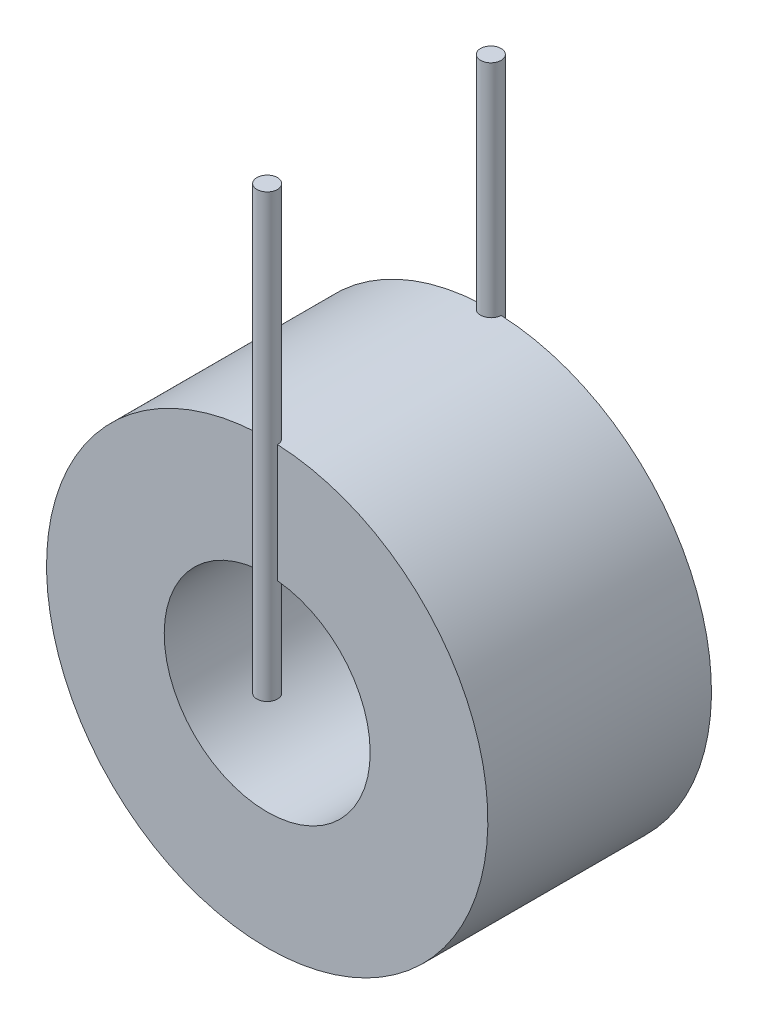
ISO-10303-21;
HEADER;
FILE_DESCRIPTION(('STEP AP214'),'2;1');
FILE_NAME('part.step','',(''),(''),'','','');
FILE_SCHEMA(('AUTOMOTIVE_DESIGN { 1 0 10303 214 1 1 1 1 }'));
ENDSEC;
DATA;
#1=APPLICATION_CONTEXT('core data for automotive mechanical design processes');
#2=APPLICATION_PROTOCOL_DEFINITION('international standard','automotive_design',2000,#1);
#3=PRODUCT_CONTEXT('',#1,'mechanical');
#4=PRODUCT('Part','Part','',(#3));
#5=PRODUCT_RELATED_PRODUCT_CATEGORY('part','',(#4));
#6=PRODUCT_DEFINITION_FORMATION('','',#4);
#7=PRODUCT_DEFINITION_CONTEXT('part definition',#1,'design');
#8=PRODUCT_DEFINITION('design','',#6,#7);
#9=PRODUCT_DEFINITION_SHAPE('','',#8);
#10=(LENGTH_UNIT() NAMED_UNIT(*) SI_UNIT(.MILLI.,.METRE.));
#11=(NAMED_UNIT(*) PLANE_ANGLE_UNIT() SI_UNIT($,.RADIAN.));
#12=(NAMED_UNIT(*) SI_UNIT($,.STERADIAN.) SOLID_ANGLE_UNIT());
#13=UNCERTAINTY_MEASURE_WITH_UNIT(LENGTH_MEASURE(1.E-05),#10,'distance_accuracy_value','');
#14=(GEOMETRIC_REPRESENTATION_CONTEXT(3) GLOBAL_UNCERTAINTY_ASSIGNED_CONTEXT((#13)) GLOBAL_UNIT_ASSIGNED_CONTEXT((#10,
#11,#12)) REPRESENTATION_CONTEXT('',''));
#15=CARTESIAN_POINT('',(0.,0.,0.));
#16=DIRECTION('',(0.,0.,1.));
#17=DIRECTION('',(1.,0.,0.));
#18=AXIS2_PLACEMENT_3D('',#15,#16,#17);
#19=CARTESIAN_POINT('',(0.,0.,-3.8));
#20=DIRECTION('',(0.,0.,1.));
#21=DIRECTION('',(1.,0.,0.));
#22=AXIS2_PLACEMENT_3D('',#19,#20,#21);
#23=CYLINDRICAL_SURFACE('',#22,7.5);
#24=CARTESIAN_POINT('',(0.,0.,-3.8));
#25=DIRECTION('',(0.,0.,1.));
#26=DIRECTION('',(1.,0.,0.));
#27=AXIS2_PLACEMENT_3D('',#24,#25,#26);
#28=CIRCLE('',#27,7.5);
#29=CARTESIAN_POINT('',(-0.35,7.49182888218891,-3.8));
#30=VERTEX_POINT('',#29);
#31=CARTESIAN_POINT('',(0.35,7.49182888218891,-3.8));
#32=VERTEX_POINT('',#31);
#33=EDGE_CURVE('E93',#30,#32,#28,.T.);
#34=ORIENTED_EDGE('',*,*,#33,.T.);
#35=CARTESIAN_POINT('',(0.,7.5,-4.15));
#36=CARTESIAN_POINT('',(0.0196481790759786,7.49999989058319,-4.14999913229711));
#37=CARTESIAN_POINT('',(0.0393103324081289,7.49992196261459,-4.14833993979747));
#38=CARTESIAN_POINT('',(0.0780923463231286,7.49961858413715,-4.14174455687192));
#39=CARTESIAN_POINT('',(0.0972115383177052,7.49939295933357,-4.13680449464221));
#40=CARTESIAN_POINT('',(0.134340214598384,7.49881972704209,-4.12378901576485));
#41=CARTESIAN_POINT('',(0.152350254542877,7.49847218122777,-4.1157151841108));
#42=CARTESIAN_POINT('',(0.186754498079162,7.49769426111854,-4.09666375636589));
#43=CARTESIAN_POINT('',(0.203149084453991,7.49726390651695,-4.08568685044286));
#44=CARTESIAN_POINT('',(0.233876685334642,7.49636835779297,-4.0611298251843));
#45=CARTESIAN_POINT('',(0.248208074516464,7.4959031366377,-4.04754767294685));
#46=CARTESIAN_POINT('',(0.274388633736311,7.49499052188153,-4.01816970972701));
#47=CARTESIAN_POINT('',(0.28623770289644,7.49454312900573,-4.00237380882458));
#48=CARTESIAN_POINT('',(0.307121553837562,7.49371643616192,-3.9690084639318));
#49=CARTESIAN_POINT('',(0.316155096549259,7.49333716620477,-3.95143824358192));
#50=CARTESIAN_POINT('',(0.331143507025438,7.49268980955694,-3.9150284856927));
#51=CARTESIAN_POINT('',(0.337098395928486,7.49242172210287,-3.89618895686965));
#52=CARTESIAN_POINT('',(0.345756248968015,7.49202720115274,-3.8577900486907));
#53=CARTESIAN_POINT('',(0.348461601330879,7.49190066363016,-3.83823120889727));
#54=CARTESIAN_POINT('',(0.350550953498603,7.49180319919455,-3.79893662922685));
#55=CARTESIAN_POINT('',(0.349934976903503,7.49183227117581,-3.77920089060783));
#56=CARTESIAN_POINT('',(0.345401148847706,7.49204265063283,-3.74012896339549));
#57=CARTESIAN_POINT('',(0.341485877248715,7.49222383916165,-3.72079247471105));
#58=CARTESIAN_POINT('',(0.330468596290174,7.49271784194065,-3.68305150195267));
#59=CARTESIAN_POINT('',(0.323366574759724,7.49303065669355,-3.66464702143857));
#60=CARTESIAN_POINT('',(0.306174444383579,7.49375279089571,-3.62928418682064));
#61=CARTESIAN_POINT('',(0.296083158032147,7.49416214836128,-3.61232640598521));
#62=CARTESIAN_POINT('',(0.273199812313009,7.49503118884158,-3.58034461189461));
#63=CARTESIAN_POINT('',(0.260407736478564,7.49549087216314,-3.56532061043061));
#64=CARTESIAN_POINT('',(0.232471366603261,7.49640928055356,-3.53761783393304));
#65=CARTESIAN_POINT('',(0.217324838074456,7.49686800428822,-3.52494131207499));
#66=CARTESIAN_POINT('',(0.185117375269553,7.49773236601536,-3.5023106936738));
#67=CARTESIAN_POINT('',(0.168056440560416,7.49813800399584,-3.49235659774647));
#68=CARTESIAN_POINT('',(0.132503156868196,7.49885049131131,-3.47545361398293));
#69=CARTESIAN_POINT('',(0.114010771187422,7.49915733811258,-3.46850480322244));
#70=CARTESIAN_POINT('',(0.076120096303944,7.49963762192587,-3.45781110669745));
#71=CARTESIAN_POINT('',(0.0567218130142733,7.49981105980856,-3.4540662000233));
#72=CARTESIAN_POINT('',(0.0175895528922871,7.50000486644243,-3.44988938958499));
#73=CARTESIAN_POINT('',(-0.00214409058253594,7.50002537919834,-3.44945436899826));
#74=CARTESIAN_POINT('',(-0.0414041011394371,7.49991140583511,-3.45190154779645));
#75=CARTESIAN_POINT('',(-0.0609304688170257,7.4997769201614,-3.45478373764831));
#76=CARTESIAN_POINT('',(-0.0992129216387285,7.49936819195665,-3.46378094292334));
#77=CARTESIAN_POINT('',(-0.117969341589688,7.49909401088205,-3.46989453679373));
#78=CARTESIAN_POINT('',(-0.154189780744432,7.49843676628995,-3.48517956658684));
#79=CARTESIAN_POINT('',(-0.171653793476698,7.49805370222728,-3.49435101782002));
#80=CARTESIAN_POINT('',(-0.204807998127926,7.49722143763746,-3.51549940819245));
#81=CARTESIAN_POINT('',(-0.220496854959933,7.49677218790927,-3.52747843837522));
#82=CARTESIAN_POINT('',(-0.249641978133239,7.4958583177051,-3.55389888798061));
#83=CARTESIAN_POINT('',(-0.263098231894448,7.49539369714251,-3.56834032127725));
#84=CARTESIAN_POINT('',(-0.287406652630567,7.49450104474623,-3.59928903640566));
#85=CARTESIAN_POINT('',(-0.298256804200661,7.49407304139373,-3.61579790215342));
#86=CARTESIAN_POINT('',(-0.317031251286467,7.49330233287455,-3.6504048408553));
#87=CARTESIAN_POINT('',(-0.324955558307247,7.49295962737248,-3.66850290755998));
#88=CARTESIAN_POINT('',(-0.337649855401037,7.49239836186137,-3.70576701958563));
#89=CARTESIAN_POINT('',(-0.342421134087499,7.4921797511411,-3.72493262513663));
#90=CARTESIAN_POINT('',(-0.348678151589518,7.49189118362017,-3.76379393986308));
#91=CARTESIAN_POINT('',(-0.350163905874278,7.4918212261196,-3.78348964654222));
#92=CARTESIAN_POINT('',(-0.349807548613212,7.49183787180865,-3.82283200262256));
#93=CARTESIAN_POINT('',(-0.347968608438249,7.49192432580001,-3.8424786808919));
#94=CARTESIAN_POINT('',(-0.341021613484186,7.49224373501053,-3.88118406246793));
#95=CARTESIAN_POINT('',(-0.335913552415725,7.49247669051155,-3.90024276464335));
#96=CARTESIAN_POINT('',(-0.32257394060794,7.49306281334101,-3.93723191091501));
#97=CARTESIAN_POINT('',(-0.314342359144019,7.49341598185192,-3.95516234391099));
#98=CARTESIAN_POINT('',(-0.294989964255231,7.49420271226802,-3.98938681029114));
#99=CARTESIAN_POINT('',(-0.283869242657796,7.49463627161797,-4.0056808956616));
#100=CARTESIAN_POINT('',(-0.25904305079633,7.49553538320283,-4.03618587376607));
#101=CARTESIAN_POINT('',(-0.245335404224108,7.49600096216382,-4.05039499445599));
#102=CARTESIAN_POINT('',(-0.215725255075165,7.49691146565429,-4.07631466791947));
#103=CARTESIAN_POINT('',(-0.199822212676494,7.49735638506776,-4.08802460436452));
#104=CARTESIAN_POINT('',(-0.166261490674913,7.49817570692667,-4.10861827270157));
#105=CARTESIAN_POINT('',(-0.148602253233997,7.49855004589574,-4.11749946546951));
#106=CARTESIAN_POINT('',(-0.112054878151132,7.49918504521766,-4.13216033888552));
#107=CARTESIAN_POINT('',(-0.0931682246976014,7.49944584003308,-4.13794368997571));
#108=CARTESIAN_POINT('',(-0.061803188965028,7.49975523944776,-4.14472456552753));
#109=CARTESIAN_POINT('',(-0.0495280531184235,7.49984662231521,-4.14670033515796));
#110=CARTESIAN_POINT('',(-0.0248371397760724,7.49996903715514,-4.1493383261862));
#111=CARTESIAN_POINT('',(-0.0124213623839974,7.5000000691721,-4.15000054855221));
#112=CARTESIAN_POINT('',(0.,7.5,-4.15));
#113=B_SPLINE_CURVE_WITH_KNOTS('',3,(#35,#36,#37,#38,#39,#40,#41,#42,#43,#44,#45,#46,#47,#48,
#49,#50,#51,#52,#53,#54,#55,#56,#57,#58,#59,#60,#61,#62,#63,#64,#65,#66,#67,#68,#69,#70,#71,#72,
#73,#74,#75,#76,#77,#78,#79,#80,#81,#82,#83,#84,#85,#86,#87,#88,#89,#90,#91,#92,#93,#94,#95,#96,
#97,#98,#99,#100,#101,#102,#103,#104,#105,#106,#107,#108,#109,#110,#111,#112),.UNSPECIFIED.,.T.,
.F.,(4,2,2,2,2,2,2,2,2,2,2,2,2,2,2,2,2,2,2,2,2,2,2,2,2,2,2,2,2,2,2,2,2,2,2,2,2,2,4),(0.,
0.0588991952366514,0.11786802210438,0.176807062583026,0.235732103654077,0.294703313010254,
0.353676918406435,0.412676440639961,0.471675557767226,0.530631287282272,0.589586597881974,
0.648495851501582,0.707405330110517,0.766338044767381,0.825271118747941,0.884260468402663,
0.943249831400757,1.00224070719311,1.06123119799026,1.12016613229054,1.17910089722288,
1.23800975724363,1.29691891222092,1.35587208208135,1.414825584115,1.47382453154907,
1.53282324698376,1.59179783525367,1.65077214585348,1.70969023151459,1.76860843052675,
1.82752720910448,1.88644411525717,1.9454108093192,2.00439202850764,2.0634260419161,
2.12238995395981,2.15962540385009,2.19686082629464),.UNSPECIFIED.);
#114=EDGE_CURVE('E57',#32,#30,#113,.T.);
#115=ORIENTED_EDGE('',*,*,#114,.T.);
#116=EDGE_LOOP('',(#34,#115));
#117=FACE_BOUND('',#116,.T.);
#118=CARTESIAN_POINT('',(0.,0.,3.8));
#119=DIRECTION('',(0.,0.,1.));
#120=DIRECTION('',(1.,0.,0.));
#121=AXIS2_PLACEMENT_3D('',#118,#119,#120);
#122=CIRCLE('',#121,7.5);
#123=CARTESIAN_POINT('',(-0.35,7.49182888218891,3.8));
#124=VERTEX_POINT('',#123);
#125=CARTESIAN_POINT('',(0.35,7.49182888218891,3.8));
#126=VERTEX_POINT('',#125);
#127=EDGE_CURVE('E85',#124,#126,#122,.T.);
#128=ORIENTED_EDGE('',*,*,#127,.F.);
#129=CARTESIAN_POINT('',(0.,7.5,3.45));
#130=CARTESIAN_POINT('',(0.0196481790759785,7.49999989058319,3.45000086770289));
#131=CARTESIAN_POINT('',(0.0393103324081289,7.49992196261459,3.45166006020253));
#132=CARTESIAN_POINT('',(0.0780923463231285,7.49961858413715,3.45825544312808));
#133=CARTESIAN_POINT('',(0.097211538317705,7.49939295933357,3.46319550535778));
#134=CARTESIAN_POINT('',(0.134340214598384,7.49881972704209,3.47621098423514));
#135=CARTESIAN_POINT('',(0.152350254542877,7.49847218122777,3.4842848158892));
#136=CARTESIAN_POINT('',(0.186754498079161,7.49769426111854,3.5033362436341));
#137=CARTESIAN_POINT('',(0.203149084453991,7.49726390651695,3.51431314955713));
#138=CARTESIAN_POINT('',(0.233876685334642,7.49636835779297,3.5388701748157));
#139=CARTESIAN_POINT('',(0.248208074516464,7.4959031366377,3.55245232705315));
#140=CARTESIAN_POINT('',(0.274388633736311,7.49499052188153,3.58183029027299));
#141=CARTESIAN_POINT('',(0.28623770289644,7.49454312900573,3.59762619117542));
#142=CARTESIAN_POINT('',(0.307121553837562,7.49371643616192,3.6309915360682));
#143=CARTESIAN_POINT('',(0.316155096549259,7.49333716620477,3.64856175641808));
#144=CARTESIAN_POINT('',(0.331143507025437,7.49268980955694,3.6849715143073));
#145=CARTESIAN_POINT('',(0.337098395928486,7.49242172210287,3.70381104313035));
#146=CARTESIAN_POINT('',(0.345756248968015,7.49202720115274,3.7422099513093));
#147=CARTESIAN_POINT('',(0.348461601330878,7.49190066363016,3.76176879110273));
#148=CARTESIAN_POINT('',(0.350550953498603,7.49180319919455,3.80106337077315));
#149=CARTESIAN_POINT('',(0.349934976903503,7.49183227117581,3.82079910939217));
#150=CARTESIAN_POINT('',(0.345401148847706,7.49204265063283,3.85987103660451));
#151=CARTESIAN_POINT('',(0.341485877248715,7.49222383916165,3.87920752528895));
#152=CARTESIAN_POINT('',(0.330468596290174,7.49271784194065,3.91694849804733));
#153=CARTESIAN_POINT('',(0.323366574759724,7.49303065669355,3.93535297856143));
#154=CARTESIAN_POINT('',(0.306174444383579,7.49375279089571,3.97071581317936));
#155=CARTESIAN_POINT('',(0.296083158032147,7.49416214836128,3.98767359401479));
#156=CARTESIAN_POINT('',(0.273199812313009,7.49503118884158,4.01965538810539));
#157=CARTESIAN_POINT('',(0.260407736478564,7.49549087216314,4.03467938956939));
#158=CARTESIAN_POINT('',(0.232471366603261,7.49640928055356,4.06238216606696));
#159=CARTESIAN_POINT('',(0.217324838074457,7.49686800428822,4.07505868792501));
#160=CARTESIAN_POINT('',(0.185117375269553,7.49773236601536,4.0976893063262));
#161=CARTESIAN_POINT('',(0.168056440560416,7.49813800399584,4.10764340225353));
#162=CARTESIAN_POINT('',(0.132503156868196,7.49885049131131,4.12454638601707));
#163=CARTESIAN_POINT('',(0.114010771187422,7.49915733811258,4.13149519677756));
#164=CARTESIAN_POINT('',(0.0761200963039443,7.49963762192587,4.14218889330255));
#165=CARTESIAN_POINT('',(0.0567218130142736,7.49981105980856,4.1459337999767));
#166=CARTESIAN_POINT('',(0.0175895528922876,7.50000486644243,4.15011061041501));
#167=CARTESIAN_POINT('',(-0.00214409058253545,7.50002537919834,4.15054563100174));
#168=CARTESIAN_POINT('',(-0.0414041011394367,7.49991140583511,4.14809845220355));
#169=CARTESIAN_POINT('',(-0.0609304688170253,7.4997769201614,4.14521626235169));
#170=CARTESIAN_POINT('',(-0.0992129216387285,7.49936819195665,4.13621905707666));
#171=CARTESIAN_POINT('',(-0.117969341589688,7.49909401088205,4.13010546320627));
#172=CARTESIAN_POINT('',(-0.154189780744432,7.49843676628995,4.11482043341316));
#173=CARTESIAN_POINT('',(-0.171653793476698,7.49805370222728,4.10564898217998));
#174=CARTESIAN_POINT('',(-0.204807998127926,7.49722143763746,4.08450059180755));
#175=CARTESIAN_POINT('',(-0.220496854959933,7.49677218790927,4.07252156162478));
#176=CARTESIAN_POINT('',(-0.249641978133239,7.4958583177051,4.04610111201939));
#177=CARTESIAN_POINT('',(-0.263098231894448,7.49539369714251,4.03165967872275));
#178=CARTESIAN_POINT('',(-0.287406652630567,7.49450104474623,4.00071096359434));
#179=CARTESIAN_POINT('',(-0.298256804200661,7.49407304139373,3.98420209784658));
#180=CARTESIAN_POINT('',(-0.317031251286467,7.49330233287455,3.9495951591447));
#181=CARTESIAN_POINT('',(-0.324955558307247,7.49295962737248,3.93149709244002));
#182=CARTESIAN_POINT('',(-0.337649855401037,7.49239836186137,3.89423298041437));
#183=CARTESIAN_POINT('',(-0.342421134087499,7.4921797511411,3.87506737486337));
#184=CARTESIAN_POINT('',(-0.348678151589518,7.49189118362017,3.83620606013692));
#185=CARTESIAN_POINT('',(-0.350163905874278,7.4918212261196,3.81651035345778));
#186=CARTESIAN_POINT('',(-0.349807548613212,7.49183787180865,3.77716799737744));
#187=CARTESIAN_POINT('',(-0.347968608438249,7.49192432580001,3.7575213191081));
#188=CARTESIAN_POINT('',(-0.341021613484186,7.49224373501053,3.71881593753207));
#189=CARTESIAN_POINT('',(-0.335913552415724,7.49247669051155,3.69975723535665));
#190=CARTESIAN_POINT('',(-0.32257394060794,7.49306281334101,3.66276808908499));
#191=CARTESIAN_POINT('',(-0.314342359144019,7.49341598185192,3.64483765608901));
#192=CARTESIAN_POINT('',(-0.294989964255231,7.49420271226802,3.61061318970886));
#193=CARTESIAN_POINT('',(-0.283869242657796,7.49463627161797,3.5943191043384));
#194=CARTESIAN_POINT('',(-0.25904305079633,7.49553538320283,3.56381412623393));
#195=CARTESIAN_POINT('',(-0.245335404224107,7.49600096216382,3.549605005544));
#196=CARTESIAN_POINT('',(-0.215725255075165,7.49691146565429,3.52368533208053));
#197=CARTESIAN_POINT('',(-0.199822212676494,7.49735638506776,3.51197539563548));
#198=CARTESIAN_POINT('',(-0.166261490674913,7.49817570692667,3.49138172729843));
#199=CARTESIAN_POINT('',(-0.148602253233997,7.49855004589574,3.48250053453049));
#200=CARTESIAN_POINT('',(-0.112054878151132,7.49918504521766,3.46783966111448));
#201=CARTESIAN_POINT('',(-0.0931682246976017,7.49944584003308,3.46205631002429));
#202=CARTESIAN_POINT('',(-0.0618031889650284,7.49975523944776,3.45527543447247));
#203=CARTESIAN_POINT('',(-0.0495280531184238,7.49984662231521,3.45329966484204));
#204=CARTESIAN_POINT('',(-0.0248371397760726,7.49996903715514,3.4506616738138));
#205=CARTESIAN_POINT('',(-0.0124213623839975,7.5000000691721,3.44999945144779));
#206=CARTESIAN_POINT('',(0.,7.5,3.45));
#207=B_SPLINE_CURVE_WITH_KNOTS('',3,(#129,#130,#131,#132,#133,#134,#135,#136,#137,#138,#139,
#140,#141,#142,#143,#144,#145,#146,#147,#148,#149,#150,#151,#152,#153,#154,#155,#156,#157,#158,
#159,#160,#161,#162,#163,#164,#165,#166,#167,#168,#169,#170,#171,#172,#173,#174,#175,#176,#177,
#178,#179,#180,#181,#182,#183,#184,#185,#186,#187,#188,#189,#190,#191,#192,#193,#194,#195,#196,
#197,#198,#199,#200,#201,#202,#203,#204,#205,#206),.UNSPECIFIED.,.T.,.F.,(4,2,2,2,2,2,2,2,2,2,2,
2,2,2,2,2,2,2,2,2,2,2,2,2,2,2,2,2,2,2,2,2,2,2,2,2,2,2,4),(0.,0.0588991952366513,
0.11786802210438,0.176807062583025,0.235732103654077,0.294703313010253,0.353676918406435,
0.412676440639962,0.471675557767226,0.530631287282271,0.589586597881974,0.648495851501583,
0.707405330110518,0.766338044767381,0.825271118747941,0.884260468402664,0.943249831400758,
1.00224070719312,1.06123119799026,1.12016613229054,1.17910089722288,1.23800975724363,
1.29691891222092,1.35587208208135,1.414825584115,1.47382453154907,1.53282324698376,
1.59179783525367,1.65077214585348,1.70969023151459,1.76860843052675,1.82752720910449,
1.88644411525717,1.9454108093192,2.00439202850764,2.0634260419161,2.12238995395981,
2.15962540385009,2.19686082629464),.UNSPECIFIED.);
#208=EDGE_CURVE('E77',#124,#126,#207,.T.);
#209=ORIENTED_EDGE('',*,*,#208,.T.);
#210=EDGE_LOOP('',(#128,#209));
#211=FACE_BOUND('',#210,.T.);
#212=ADVANCED_FACE('F35',(#117,#211),#23,.T.);
#213=CARTESIAN_POINT('',(0.,0.,-3.8));
#214=DIRECTION('',(0.,0.,1.));
#215=DIRECTION('',(1.,0.,0.));
#216=AXIS2_PLACEMENT_3D('',#213,#214,#215);
#217=CYLINDRICAL_SURFACE('',#216,3.5);
#218=CARTESIAN_POINT('',(0.,3.5,-4.15));
#219=CARTESIAN_POINT('',(0.0196071238270451,3.49999977432269,-4.14999915093487));
#220=CARTESIAN_POINT('',(0.0392272108087206,3.49983348958672,-4.14834685588624));
#221=CARTESIAN_POINT('',(0.077923439473893,3.49918613658158,-4.14178047039835));
#222=CARTESIAN_POINT('',(0.0969989577090898,3.49870472151909,-4.13686278639139));
#223=CARTESIAN_POINT('',(0.134040086408695,3.49748145097074,-4.12391021579076));
#224=CARTESIAN_POINT('',(0.152006359615219,3.49673975280248,-4.11587721181853));
#225=CARTESIAN_POINT('',(0.186331656336143,3.49507885088007,-4.09692568222392));
#226=CARTESIAN_POINT('',(0.202690998572677,3.49415968243346,-4.08600773039995));
#227=CARTESIAN_POINT('',(0.233400842735929,3.49224310519463,-4.0615540558182));
#228=CARTESIAN_POINT('',(0.247744750692213,3.49124545550853,-4.04801007020929));
#229=CARTESIAN_POINT('',(0.273959882500845,3.48928634917192,-4.01870641300794));
#230=CARTESIAN_POINT('',(0.285830991978929,3.48832489419721,-4.00294663898516));
#231=CARTESIAN_POINT('',(0.306786889655266,3.48654457043474,-3.96961751391073));
#232=CARTESIAN_POINT('',(0.315865712909208,3.48572600848817,-3.9520443945668));
#233=CARTESIAN_POINT('',(0.330941234659966,3.48432713141283,-3.91561354493326));
#234=CARTESIAN_POINT('',(0.336938009306952,3.48374681039778,-3.89675584639562));
#235=CARTESIAN_POINT('',(0.345659664560663,3.48289229425542,-3.8583583696969));
#236=CARTESIAN_POINT('',(0.348395478551328,3.48261707639334,-3.83882109810173));
#237=CARTESIAN_POINT('',(0.350551349797376,3.48240075071184,-3.79956289781148));
#238=CARTESIAN_POINT('',(0.34997149420478,3.48245963411061,-3.77984197395728));
#239=CARTESIAN_POINT('',(0.345521498088437,3.48290392414627,-3.74085164160734));
#240=CARTESIAN_POINT('',(0.341663295443593,3.48328814606728,-3.72158085523496));
#241=CARTESIAN_POINT('',(0.330784700452705,3.48433797000596,-3.68396171287962));
#242=CARTESIAN_POINT('',(0.323764265389511,3.48500357582472,-3.66561336936124));
#243=CARTESIAN_POINT('',(0.306747312858527,3.48654253308225,-3.63032224444539));
#244=CARTESIAN_POINT('',(0.296745498951993,3.48741625367855,-3.61338203367874));
#245=CARTESIAN_POINT('',(0.274053509573629,3.48927268106508,-3.58141617478084));
#246=CARTESIAN_POINT('',(0.261363255417776,3.49025539104475,-3.56639058270638));
#247=CARTESIAN_POINT('',(0.233587939344224,3.49222434859546,-3.53861111210384));
#248=CARTESIAN_POINT('',(0.218492567597977,3.49321059266549,-3.52586753934172));
#249=CARTESIAN_POINT('',(0.186371318607989,3.49507140177481,-3.50309372848136));
#250=CARTESIAN_POINT('',(0.16934543919986,3.4959459666889,-3.49306349342523));
#251=CARTESIAN_POINT('',(0.133839336992327,3.49748516483484,-3.47600149289141));
#252=CARTESIAN_POINT('',(0.115358861236466,3.49814976145169,-3.46897025031368));
#253=CARTESIAN_POINT('',(0.0774715260654759,3.49919376604493,-3.45811337915089));
#254=CARTESIAN_POINT('',(0.0580646943718098,3.49957318254972,-3.45428765470328));
#255=CARTESIAN_POINT('',(0.018964784682166,3.50000298083909,-3.44996349229283));
#256=CARTESIAN_POINT('',(-0.000726705736922457,3.50005476893707,-3.44945083311163));
#257=CARTESIAN_POINT('',(-0.0399153276604951,3.49982724614879,-3.45173000206707));
#258=CARTESIAN_POINT('',(-0.0594124617871647,3.49954793973564,-3.45452178556035));
#259=CARTESIAN_POINT('',(-0.0976178723921363,3.49869051538718,-3.46331879339755));
#260=CARTESIAN_POINT('',(-0.116327697140207,3.49811301671314,-3.4693173590673));
#261=CARTESIAN_POINT('',(-0.152475512484324,3.49672399601213,-3.48435081091304));
#262=CARTESIAN_POINT('',(-0.169913474554991,3.49591246873839,-3.49338576516379));
#263=CARTESIAN_POINT('',(-0.20308686306025,3.49414266365648,-3.51427079353237));
#264=CARTESIAN_POINT('',(-0.218816380912121,3.49318390261204,-3.52613021112404));
#265=CARTESIAN_POINT('',(-0.248066568159157,3.49122876504332,-3.55231412370932));
#266=CARTESIAN_POINT('',(-0.261587182097212,3.4902323875754,-3.56663868057461));
#267=CARTESIAN_POINT('',(-0.286085138460501,3.48831008449264,-3.59740830113065));
#268=CARTESIAN_POINT('',(-0.29705314753784,3.48738442548641,-3.61386081478992));
#269=CARTESIAN_POINT('',(-0.31607039056034,3.48571241361311,-3.64838257605134));
#270=CARTESIAN_POINT('',(-0.324119664418859,3.48496605829413,-3.66645180154094));
#271=CARTESIAN_POINT('',(-0.337055323039566,3.48373881671917,-3.70366205881303));
#272=CARTESIAN_POINT('',(-0.341947261184152,3.48325746457426,-3.72280114403189));
#273=CARTESIAN_POINT('',(-0.348447402495312,3.48261327849007,-3.76163411928627));
#274=CARTESIAN_POINT('',(-0.350055699839831,3.48245043541565,-3.78132799339349));
#275=CARTESIAN_POINT('',(-0.34994159846494,3.48246189587647,-3.82061874092485));
#276=CARTESIAN_POINT('',(-0.348233861357589,3.48263471530453,-3.84021565900899));
#277=CARTESIAN_POINT('',(-0.341566908537278,3.48329486361341,-3.8788427210089));
#278=CARTESIAN_POINT('',(-0.336607689166756,3.48378219284801,-3.89787286428709));
#279=CARTESIAN_POINT('',(-0.323582590204126,3.48501603892115,-3.93482607216675));
#280=CARTESIAN_POINT('',(-0.315517140519321,3.48576251989126,-3.9527492895704));
#281=CARTESIAN_POINT('',(-0.296510044218866,3.48743063143776,-3.98698991208486));
#282=CARTESIAN_POINT('',(-0.285568413709395,3.48835226103333,-4.00330732618722));
#283=CARTESIAN_POINT('',(-0.261064494699866,3.49027170523394,-4.03394828606518));
#284=CARTESIAN_POINT('',(-0.247491282111594,3.49126982654363,-4.04826307672848));
#285=CARTESIAN_POINT('',(-0.218131094728789,3.49322699155074,-4.07441828144488));
#286=CARTESIAN_POINT('',(-0.20234359043789,3.49418602583042,-4.08625810197501));
#287=CARTESIAN_POINT('',(-0.168959501956451,3.49595946724206,-4.10715070884912));
#288=CARTESIAN_POINT('',(-0.151358462271367,3.49677350409384,-4.11619640183081));
#289=CARTESIAN_POINT('',(-0.114890397685192,3.49816120237464,-4.13119184798835));
#290=CARTESIAN_POINT('',(-0.096024827438963,3.49873513468379,-4.13714509183374));
#291=CARTESIAN_POINT('',(-0.0642103914919963,3.49943374820807,-4.14430221597968));
#292=CARTESIAN_POINT('',(-0.0514648934955778,3.49964510242141,-4.14643596550478));
#293=CARTESIAN_POINT('',(-0.0258148032860593,3.49992830232775,-4.14928513412162));
#294=CARTESIAN_POINT('',(-0.0129102117292951,3.50000014859608,-4.15000055906265));
#295=CARTESIAN_POINT('',(0.,3.5,-4.15));
#296=B_SPLINE_CURVE_WITH_KNOTS('',3,(#218,#219,#220,#221,#222,#223,#224,#225,#226,#227,#228,
#229,#230,#231,#232,#233,#234,#235,#236,#237,#238,#239,#240,#241,#242,#243,#244,#245,#246,#247,
#248,#249,#250,#251,#252,#253,#254,#255,#256,#257,#258,#259,#260,#261,#262,#263,#264,#265,#266,
#267,#268,#269,#270,#271,#272,#273,#274,#275,#276,#277,#278,#279,#280,#281,#282,#283,#284,#285,
#286,#287,#288,#289,#290,#291,#292,#293,#294,#295),.UNSPECIFIED.,.T.,.F.,(4,2,2,2,2,2,2,2,2,2,2,
2,2,2,2,2,2,2,2,2,2,2,2,2,2,2,2,2,2,2,2,2,2,2,2,2,2,2,4),(0.,0.0587742281939658,
0.11761324499242,0.176416760006272,0.235208588153974,0.294188499018031,0.353171137272471,
0.412278914152775,0.471385230548764,0.530292812158188,0.589198845395218,0.647891291043886,
0.706584529565718,0.765382664805132,0.82418252115894,0.883241569686723,0.942300684429201,
1.00137009242754,1.06043773386404,1.11925166012715,1.178064791817,1.23675627353007,
1.29544907117313,1.35433879262045,1.4132299923358,1.47233325263009,1.53143570466381,
1.59043391707551,1.64943043733855,1.70816670252885,1.76690303379114,1.8256312387698,
1.88435911488636,1.94333621099679,2.00232743422935,2.06146720859185,2.12054008178353,
2.15923983531322,2.1979394292416),.UNSPECIFIED.);
#297=CARTESIAN_POINT('',(0.35,3.48245602987317,-3.8));
#298=VERTEX_POINT('',#297);
#299=CARTESIAN_POINT('',(-0.35,3.48245602987349,-3.79999999999998));
#300=VERTEX_POINT('',#299);
#301=EDGE_CURVE('E82',#298,#300,#296,.T.);
#302=ORIENTED_EDGE('',*,*,#301,.F.);
#303=CARTESIAN_POINT('',(0.,0.,-3.8));
#304=DIRECTION('',(0.,0.,1.));
#305=DIRECTION('',(1.,0.,0.));
#306=AXIS2_PLACEMENT_3D('',#303,#304,#305);
#307=CIRCLE('',#306,3.5);
#308=EDGE_CURVE('E89',#300,#298,#307,.T.);
#309=ORIENTED_EDGE('',*,*,#308,.F.);
#310=EDGE_LOOP('',(#302,#309));
#311=FACE_BOUND('',#310,.T.);
#312=CARTESIAN_POINT('',(0.,3.5,3.45));
#313=CARTESIAN_POINT('',(0.019607123827045,3.49999977432269,3.45000084906513));
#314=CARTESIAN_POINT('',(0.0392272108087206,3.49983348958672,3.45165314411376));
#315=CARTESIAN_POINT('',(0.0779234394738929,3.49918613658158,3.45821952960165));
#316=CARTESIAN_POINT('',(0.0969989577090898,3.49870472151909,3.46313721360861));
#317=CARTESIAN_POINT('',(0.134040086408695,3.49748145097074,3.47608978420924));
#318=CARTESIAN_POINT('',(0.152006359615218,3.49673975280248,3.48412278818147));
#319=CARTESIAN_POINT('',(0.186331656336142,3.49507885088007,3.50307431777608));
#320=CARTESIAN_POINT('',(0.202690998572677,3.49415968243346,3.51399226960005));
#321=CARTESIAN_POINT('',(0.233400842735929,3.49224310519463,3.5384459441818));
#322=CARTESIAN_POINT('',(0.247744750692212,3.49124545550853,3.55198992979071));
#323=CARTESIAN_POINT('',(0.273959882500844,3.48928634917192,3.58129358699206));
#324=CARTESIAN_POINT('',(0.285830991978928,3.48832489419721,3.59705336101484));
#325=CARTESIAN_POINT('',(0.306786889655266,3.48654457043474,3.63038248608927));
#326=CARTESIAN_POINT('',(0.315865712909208,3.48572600848817,3.6479556054332));
#327=CARTESIAN_POINT('',(0.330941234659966,3.48432713141284,3.68438645506674));
#328=CARTESIAN_POINT('',(0.336938009306952,3.48374681039778,3.70324415360438));
#329=CARTESIAN_POINT('',(0.345659664560663,3.48289229425542,3.7416416303031));
#330=CARTESIAN_POINT('',(0.348395478551328,3.48261707639334,3.76117890189827));
#331=CARTESIAN_POINT('',(0.350551349797376,3.48240075071184,3.80043710218852));
#332=CARTESIAN_POINT('',(0.34997149420478,3.48245963411061,3.82015802604272));
#333=CARTESIAN_POINT('',(0.345521498088437,3.48290392414627,3.85914835839266));
#334=CARTESIAN_POINT('',(0.341663295443593,3.48328814606728,3.87841914476504));
#335=CARTESIAN_POINT('',(0.330784700452705,3.48433797000596,3.91603828712038));
#336=CARTESIAN_POINT('',(0.323764265389511,3.48500357582472,3.93438663063876));
#337=CARTESIAN_POINT('',(0.306747312858527,3.48654253308225,3.96967775555461));
#338=CARTESIAN_POINT('',(0.296745498951993,3.48741625367855,3.98661796632126));
#339=CARTESIAN_POINT('',(0.27405350957363,3.48927268106508,4.01858382521916));
#340=CARTESIAN_POINT('',(0.261363255417777,3.49025539104475,4.03360941729362));
#341=CARTESIAN_POINT('',(0.233587939344224,3.49222434859546,4.06138888789616));
#342=CARTESIAN_POINT('',(0.218492567597977,3.49321059266549,4.07413246065828));
#343=CARTESIAN_POINT('',(0.186371318607989,3.49507140177481,4.09690627151864));
#344=CARTESIAN_POINT('',(0.16934543919986,3.4959459666889,4.10693650657477));
#345=CARTESIAN_POINT('',(0.133839336992327,3.49748516483484,4.12399850710859));
#346=CARTESIAN_POINT('',(0.115358861236466,3.49814976145169,4.13102974968632));
#347=CARTESIAN_POINT('',(0.0774715260654757,3.49919376604493,4.14188662084911));
#348=CARTESIAN_POINT('',(0.0580646943718096,3.49957318254972,4.14571234529672));
#349=CARTESIAN_POINT('',(0.0189647846821659,3.50000298083909,4.15003650770717));
#350=CARTESIAN_POINT('',(-0.00072670573692263,3.50005476893707,4.15054916688837));
#351=CARTESIAN_POINT('',(-0.0399153276604952,3.49982724614879,4.14826999793293));
#352=CARTESIAN_POINT('',(-0.0594124617871646,3.49954793973564,4.14547821443965));
#353=CARTESIAN_POINT('',(-0.0976178723921361,3.49869051538718,4.13668120660245));
#354=CARTESIAN_POINT('',(-0.116327697140207,3.49811301671314,4.1306826409327));
#355=CARTESIAN_POINT('',(-0.152475512484324,3.49672399601213,4.11564918908696));
#356=CARTESIAN_POINT('',(-0.169913474554991,3.49591246873839,4.10661423483621));
#357=CARTESIAN_POINT('',(-0.20308686306025,3.49414266365648,4.08572920646763));
#358=CARTESIAN_POINT('',(-0.218816380912121,3.49318390261204,4.07386978887596));
#359=CARTESIAN_POINT('',(-0.248066568159157,3.49122876504332,4.04768587629068));
#360=CARTESIAN_POINT('',(-0.261587182097212,3.4902323875754,4.03336131942539));
#361=CARTESIAN_POINT('',(-0.286085138460501,3.48831008449264,4.00259169886935));
#362=CARTESIAN_POINT('',(-0.29705314753784,3.48738442548641,3.98613918521008));
#363=CARTESIAN_POINT('',(-0.31607039056034,3.48571241361311,3.95161742394866));
#364=CARTESIAN_POINT('',(-0.324119664418859,3.48496605829413,3.93354819845906));
#365=CARTESIAN_POINT('',(-0.337055323039566,3.48373881671917,3.89633794118697));
#366=CARTESIAN_POINT('',(-0.341947261184152,3.48325746457426,3.87719885596811));
#367=CARTESIAN_POINT('',(-0.348447402495312,3.48261327849007,3.83836588071373));
#368=CARTESIAN_POINT('',(-0.350055699839831,3.48245043541565,3.81867200660651));
#369=CARTESIAN_POINT('',(-0.34994159846494,3.48246189587647,3.77938125907515));
#370=CARTESIAN_POINT('',(-0.348233861357589,3.48263471530453,3.75978434099101));
#371=CARTESIAN_POINT('',(-0.341566908537278,3.48329486361341,3.7211572789911));
#372=CARTESIAN_POINT('',(-0.336607689166756,3.48378219284801,3.70212713571291));
#373=CARTESIAN_POINT('',(-0.323582590204126,3.48501603892115,3.66517392783325));
#374=CARTESIAN_POINT('',(-0.315517140519321,3.48576251989126,3.6472507104296));
#375=CARTESIAN_POINT('',(-0.296510044218865,3.48743063143776,3.61301008791514));
#376=CARTESIAN_POINT('',(-0.285568413709395,3.48835226103333,3.59669267381278));
#377=CARTESIAN_POINT('',(-0.261064494699866,3.49027170523394,3.56605171393482));
#378=CARTESIAN_POINT('',(-0.247491282111594,3.49126982654363,3.55173692327152));
#379=CARTESIAN_POINT('',(-0.218131094728788,3.49322699155074,3.52558171855512));
#380=CARTESIAN_POINT('',(-0.20234359043789,3.49418602583042,3.51374189802499));
#381=CARTESIAN_POINT('',(-0.168959501956451,3.49595946724206,3.49284929115088));
#382=CARTESIAN_POINT('',(-0.151358462271367,3.49677350409384,3.48380359816919));
#383=CARTESIAN_POINT('',(-0.114890397685193,3.49816120237464,3.46880815201165));
#384=CARTESIAN_POINT('',(-0.0960248274389633,3.49873513468379,3.46285490816626));
#385=CARTESIAN_POINT('',(-0.0642103914919965,3.49943374820807,3.45569778402032));
#386=CARTESIAN_POINT('',(-0.0514648934955781,3.49964510242141,3.45356403449522));
#387=CARTESIAN_POINT('',(-0.0258148032860596,3.49992830232775,3.45071486587838));
#388=CARTESIAN_POINT('',(-0.0129102117292953,3.50000014859608,3.44999944093735));
#389=CARTESIAN_POINT('',(0.,3.5,3.45));
#390=B_SPLINE_CURVE_WITH_KNOTS('',3,(#312,#313,#314,#315,#316,#317,#318,#319,#320,#321,#322,
#323,#324,#325,#326,#327,#328,#329,#330,#331,#332,#333,#334,#335,#336,#337,#338,#339,#340,#341,
#342,#343,#344,#345,#346,#347,#348,#349,#350,#351,#352,#353,#354,#355,#356,#357,#358,#359,#360,
#361,#362,#363,#364,#365,#366,#367,#368,#369,#370,#371,#372,#373,#374,#375,#376,#377,#378,#379,
#380,#381,#382,#383,#384,#385,#386,#387,#388,#389),.UNSPECIFIED.,.T.,.F.,(4,2,2,2,2,2,2,2,2,2,2,
2,2,2,2,2,2,2,2,2,2,2,2,2,2,2,2,2,2,2,2,2,2,2,2,2,2,2,4),(0.,0.0587742281939658,
0.11761324499242,0.176416760006271,0.235208588153974,0.294188499018031,0.35317113727247,
0.412278914152776,0.471385230548764,0.530292812158188,0.589198845395218,0.647891291043887,
0.706584529565718,0.765382664805131,0.824182521158939,0.883241569686723,0.942300684429201,
1.00137009242754,1.06043773386404,1.11925166012715,1.178064791817,1.23675627353007,
1.29544907117313,1.35433879262044,1.4132299923358,1.47233325263009,1.53143570466381,
1.59043391707551,1.64943043733855,1.70816670252885,1.76690303379114,1.8256312387698,
1.88435911488636,1.94333621099679,2.00232743422935,2.06146720859185,2.12054008178353,
2.15923983531322,2.1979394292416),.UNSPECIFIED.);
#391=CARTESIAN_POINT('',(-0.35,3.48245602987349,3.80000000000002));
#392=VERTEX_POINT('',#391);
#393=CARTESIAN_POINT('',(0.35,3.48245602987317,3.8));
#394=VERTEX_POINT('',#393);
#395=EDGE_CURVE('E50',#392,#394,#390,.T.);
#396=ORIENTED_EDGE('',*,*,#395,.F.);
#397=CARTESIAN_POINT('',(0.,0.,3.8));
#398=DIRECTION('',(0.,0.,1.));
#399=DIRECTION('',(1.,0.,0.));
#400=AXIS2_PLACEMENT_3D('',#397,#398,#399);
#401=CIRCLE('',#400,3.5);
#402=EDGE_CURVE('E90',#392,#394,#401,.T.);
#403=ORIENTED_EDGE('',*,*,#402,.T.);
#404=EDGE_LOOP('',(#396,#403));
#405=FACE_BOUND('',#404,.T.);
#406=ADVANCED_FACE('F104',(#311,#405),#217,.F.);
#407=CARTESIAN_POINT('',(0.,0.,3.8));
#408=DIRECTION('',(0.,0.,1.));
#409=DIRECTION('',(1.,0.,0.));
#410=AXIS2_PLACEMENT_3D('',#407,#408,#409);
#411=PLANE('',#410);
#412=ORIENTED_EDGE('',*,*,#402,.F.);
#413=DIRECTION('',(0.,-1.,0.));
#414=VECTOR('',#413,1.);
#415=CARTESIAN_POINT('',(-0.35,15.,3.8));
#416=LINE('',#415,#414);
#417=EDGE_CURVE('E11',#392,#124,#416,.F.);
#418=ORIENTED_EDGE('',*,*,#417,.T.);
#419=ORIENTED_EDGE('',*,*,#127,.T.);
#420=DIRECTION('',(0.,-1.,0.));
#421=VECTOR('',#420,1.);
#422=CARTESIAN_POINT('',(0.35,15.,3.8));
#423=LINE('',#422,#421);
#424=EDGE_CURVE('E43',#126,#394,#423,.T.);
#425=ORIENTED_EDGE('',*,*,#424,.T.);
#426=EDGE_LOOP('',(#412,#418,#419,#425));
#427=FACE_BOUND('',#426,.T.);
#428=ADVANCED_FACE('F88',(#427),#411,.T.);
#429=CARTESIAN_POINT('',(0.,0.,-3.8));
#430=DIRECTION('',(0.,0.,1.));
#431=DIRECTION('',(1.,0.,0.));
#432=AXIS2_PLACEMENT_3D('',#429,#430,#431);
#433=PLANE('',#432);
#434=DIRECTION('',(0.,-1.,0.));
#435=VECTOR('',#434,1.);
#436=CARTESIAN_POINT('',(-0.35,15.,-3.8));
#437=LINE('',#436,#435);
#438=EDGE_CURVE('E120',#300,#30,#437,.F.);
#439=ORIENTED_EDGE('',*,*,#438,.F.);
#440=ORIENTED_EDGE('',*,*,#308,.T.);
#441=DIRECTION('',(0.,-1.,0.));
#442=VECTOR('',#441,1.);
#443=CARTESIAN_POINT('',(0.35,15.,-3.8));
#444=LINE('',#443,#442);
#445=EDGE_CURVE('E123',#32,#298,#444,.T.);
#446=ORIENTED_EDGE('',*,*,#445,.F.);
#447=ORIENTED_EDGE('',*,*,#33,.F.);
#448=EDGE_LOOP('',(#439,#440,#446,#447));
#449=FACE_BOUND('',#448,.T.);
#450=ADVANCED_FACE('F112',(#449),#433,.F.);
#451=CARTESIAN_POINT('',(0.,15.,-3.8));
#452=DIRECTION('',(0.,-1.,0.));
#453=DIRECTION('',(0.,0.,-1.));
#454=AXIS2_PLACEMENT_3D('',#451,#452,#453);
#455=CYLINDRICAL_SURFACE('',#454,0.35);
#456=ORIENTED_EDGE('',*,*,#114,.F.);
#457=ORIENTED_EDGE('',*,*,#445,.T.);
#458=ORIENTED_EDGE('',*,*,#301,.T.);
#459=ORIENTED_EDGE('',*,*,#438,.T.);
#460=EDGE_LOOP('',(#456,#457,#458,#459));
#461=FACE_BOUND('',#460,.T.);
#462=CARTESIAN_POINT('',(0.,15.,-3.8));
#463=DIRECTION('',(0.,1.,0.));
#464=DIRECTION('',(0.,0.,1.));
#465=AXIS2_PLACEMENT_3D('',#462,#463,#464);
#466=CIRCLE('',#465,0.35);
#467=CARTESIAN_POINT('',(0.,15.,-3.45));
#468=VERTEX_POINT('',#467);
#469=EDGE_CURVE('E126',#468,#468,#466,.T.);
#470=ORIENTED_EDGE('',*,*,#469,.F.);
#471=EDGE_LOOP('',(#470));
#472=FACE_BOUND('',#471,.T.);
#473=CARTESIAN_POINT('',(0.,0.,-3.8));
#474=DIRECTION('',(0.,1.,0.));
#475=DIRECTION('',(0.,0.,1.));
#476=AXIS2_PLACEMENT_3D('',#473,#474,#475);
#477=CIRCLE('',#476,0.35);
#478=CARTESIAN_POINT('',(0.,0.,-3.45));
#479=VERTEX_POINT('',#478);
#480=EDGE_CURVE('E86',#479,#479,#477,.T.);
#481=ORIENTED_EDGE('',*,*,#480,.T.);
#482=EDGE_LOOP('',(#481));
#483=FACE_BOUND('',#482,.T.);
#484=ADVANCED_FACE('F107',(#461,#472,#483),#455,.T.);
#485=CARTESIAN_POINT('',(0.,15.,-3.8));
#486=DIRECTION('',(0.,1.,0.));
#487=DIRECTION('',(0.,0.,1.));
#488=AXIS2_PLACEMENT_3D('',#485,#486,#487);
#489=PLANE('',#488);
#490=ORIENTED_EDGE('',*,*,#469,.T.);
#491=EDGE_LOOP('',(#490));
#492=FACE_BOUND('',#491,.T.);
#493=ADVANCED_FACE('F111',(#492),#489,.T.);
#494=CARTESIAN_POINT('',(0.,0.,-3.8));
#495=DIRECTION('',(0.,1.,0.));
#496=DIRECTION('',(0.,0.,1.));
#497=AXIS2_PLACEMENT_3D('',#494,#495,#496);
#498=PLANE('',#497);
#499=ORIENTED_EDGE('',*,*,#480,.F.);
#500=EDGE_LOOP('',(#499));
#501=FACE_BOUND('',#500,.T.);
#502=ADVANCED_FACE('F114',(#501),#498,.F.);
#503=CARTESIAN_POINT('',(0.,15.,3.8));
#504=DIRECTION('',(0.,-1.,0.));
#505=DIRECTION('',(0.,0.,-1.));
#506=AXIS2_PLACEMENT_3D('',#503,#504,#505);
#507=CYLINDRICAL_SURFACE('',#506,0.35);
#508=ORIENTED_EDGE('',*,*,#417,.F.);
#509=ORIENTED_EDGE('',*,*,#395,.T.);
#510=ORIENTED_EDGE('',*,*,#424,.F.);
#511=ORIENTED_EDGE('',*,*,#208,.F.);
#512=EDGE_LOOP('',(#508,#509,#510,#511));
#513=FACE_BOUND('',#512,.T.);
#514=CARTESIAN_POINT('',(0.,15.,3.8));
#515=DIRECTION('',(0.,1.,0.));
#516=DIRECTION('',(0.,0.,-1.));
#517=AXIS2_PLACEMENT_3D('',#514,#515,#516);
#518=CIRCLE('',#517,0.35);
#519=CARTESIAN_POINT('',(0.,15.,3.45));
#520=VERTEX_POINT('',#519);
#521=EDGE_CURVE('E159',#520,#520,#518,.T.);
#522=ORIENTED_EDGE('',*,*,#521,.F.);
#523=EDGE_LOOP('',(#522));
#524=FACE_BOUND('',#523,.T.);
#525=CARTESIAN_POINT('',(0.,0.,3.8));
#526=DIRECTION('',(0.,1.,0.));
#527=DIRECTION('',(0.,0.,-1.));
#528=AXIS2_PLACEMENT_3D('',#525,#526,#527);
#529=CIRCLE('',#528,0.35);
#530=CARTESIAN_POINT('',(0.,0.,3.45));
#531=VERTEX_POINT('',#530);
#532=EDGE_CURVE('E161',#531,#531,#529,.T.);
#533=ORIENTED_EDGE('',*,*,#532,.T.);
#534=EDGE_LOOP('',(#533));
#535=FACE_BOUND('',#534,.T.);
#536=ADVANCED_FACE('F75',(#513,#524,#535),#507,.T.);
#537=CARTESIAN_POINT('',(0.,15.,3.8));
#538=DIRECTION('',(0.,-1.,0.));
#539=DIRECTION('',(0.,0.,-1.));
#540=AXIS2_PLACEMENT_3D('',#537,#538,#539);
#541=PLANE('',#540);
#542=ORIENTED_EDGE('',*,*,#521,.T.);
#543=EDGE_LOOP('',(#542));
#544=FACE_BOUND('',#543,.T.);
#545=ADVANCED_FACE('F140',(#544),#541,.F.);
#546=CARTESIAN_POINT('',(0.,0.,3.8));
#547=DIRECTION('',(0.,-1.,0.));
#548=DIRECTION('',(0.,0.,-1.));
#549=AXIS2_PLACEMENT_3D('',#546,#547,#548);
#550=PLANE('',#549);
#551=ORIENTED_EDGE('',*,*,#532,.F.);
#552=EDGE_LOOP('',(#551));
#553=FACE_BOUND('',#552,.T.);
#554=ADVANCED_FACE('F141',(#553),#550,.T.);
#555=CLOSED_SHELL('',(#212,#406,#428,#450,#484,#493,#502,#536,#545,#554));
#556=MANIFOLD_SOLID_BREP('B2',#555);
#557=ADVANCED_BREP_SHAPE_REPRESENTATION('',(#18,#556),#14);
#558=SHAPE_DEFINITION_REPRESENTATION(#9,#557);
ENDSEC;
END-ISO-10303-21;
